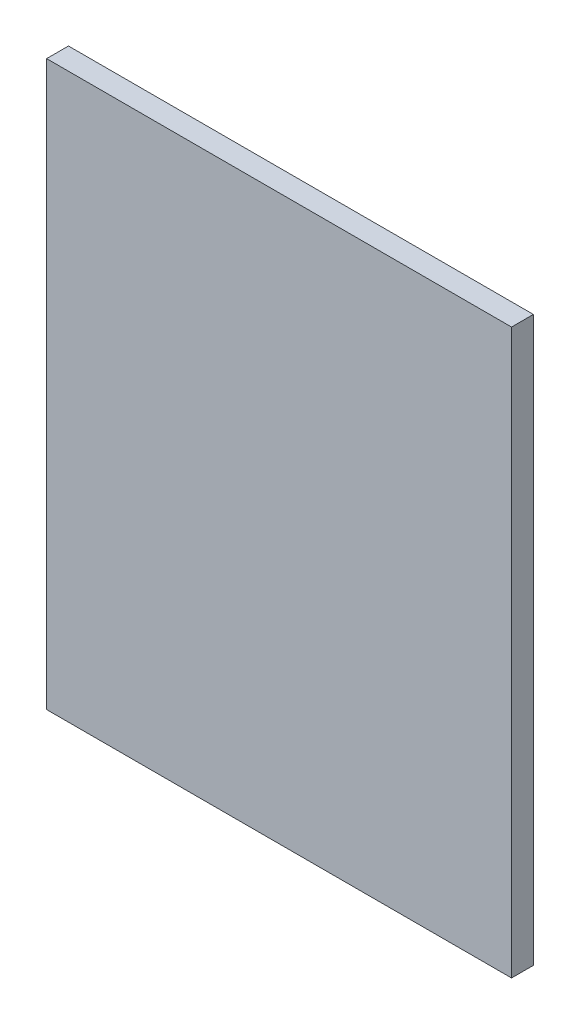
ISO-10303-21;
HEADER;
FILE_DESCRIPTION(('STEP AP214'),'2;1');
FILE_NAME('part.step','',(''),(''),'','','');
FILE_SCHEMA(('AUTOMOTIVE_DESIGN { 1 0 10303 214 1 1 1 1 }'));
ENDSEC;
DATA;
#1=APPLICATION_CONTEXT('core data for automotive mechanical design processes');
#2=APPLICATION_PROTOCOL_DEFINITION('international standard','automotive_design',2000,#1);
#3=PRODUCT_CONTEXT('',#1,'mechanical');
#4=PRODUCT('Part','Part','',(#3));
#5=PRODUCT_RELATED_PRODUCT_CATEGORY('part','',(#4));
#6=PRODUCT_DEFINITION_FORMATION('','',#4);
#7=PRODUCT_DEFINITION_CONTEXT('part definition',#1,'design');
#8=PRODUCT_DEFINITION('design','',#6,#7);
#9=PRODUCT_DEFINITION_SHAPE('','',#8);
#10=(LENGTH_UNIT() NAMED_UNIT(*) SI_UNIT(.MILLI.,.METRE.));
#11=(NAMED_UNIT(*) PLANE_ANGLE_UNIT() SI_UNIT($,.RADIAN.));
#12=(NAMED_UNIT(*) SI_UNIT($,.STERADIAN.) SOLID_ANGLE_UNIT());
#13=UNCERTAINTY_MEASURE_WITH_UNIT(LENGTH_MEASURE(1.E-05),#10,'distance_accuracy_value','');
#14=(GEOMETRIC_REPRESENTATION_CONTEXT(3) GLOBAL_UNCERTAINTY_ASSIGNED_CONTEXT((#13)) GLOBAL_UNIT_ASSIGNED_CONTEXT((#10,
#11,#12)) REPRESENTATION_CONTEXT('',''));
#15=CARTESIAN_POINT('',(0.,0.,0.));
#16=DIRECTION('',(0.,0.,1.));
#17=DIRECTION('',(1.,0.,0.));
#18=AXIS2_PLACEMENT_3D('',#15,#16,#17);
#19=CARTESIAN_POINT('',(61.5,121.5,-818.5));
#20=DIRECTION('',(-1.,0.,0.));
#21=DIRECTION('',(0.,0.,1.));
#22=AXIS2_PLACEMENT_3D('',#19,#20,#21);
#23=PLANE('',#22);
#24=DIRECTION('',(0.,-1.,0.));
#25=VECTOR('',#24,1.);
#26=CARTESIAN_POINT('',(61.5,121.5,-758.5));
#27=LINE('',#26,#25);
#28=CARTESIAN_POINT('',(61.5,1670.,-758.5));
#29=VERTEX_POINT('',#28);
#30=CARTESIAN_POINT('',(61.5,121.5,-758.5));
#31=VERTEX_POINT('',#30);
#32=EDGE_CURVE('E103',#29,#31,#27,.T.);
#33=ORIENTED_EDGE('',*,*,#32,.F.);
#34=DIRECTION('',(0.,0.,1.));
#35=VECTOR('',#34,1.);
#36=CARTESIAN_POINT('',(61.5,1670.,-818.5));
#37=LINE('',#36,#35);
#38=CARTESIAN_POINT('',(61.5,1670.,-818.5));
#39=VERTEX_POINT('',#38);
#40=EDGE_CURVE('E11',#39,#29,#37,.T.);
#41=ORIENTED_EDGE('',*,*,#40,.F.);
#42=DIRECTION('',(0.,-1.,0.));
#43=VECTOR('',#42,1.);
#44=CARTESIAN_POINT('',(61.5,121.5,-818.5));
#45=LINE('',#44,#43);
#46=CARTESIAN_POINT('',(61.5,121.5,-818.5));
#47=VERTEX_POINT('',#46);
#48=EDGE_CURVE('E97',#39,#47,#45,.T.);
#49=ORIENTED_EDGE('',*,*,#48,.T.);
#50=DIRECTION('',(0.,0.,1.));
#51=VECTOR('',#50,1.);
#52=CARTESIAN_POINT('',(61.5,121.5,-818.5));
#53=LINE('',#52,#51);
#54=EDGE_CURVE('E42',#47,#31,#53,.T.);
#55=ORIENTED_EDGE('',*,*,#54,.T.);
#56=EDGE_LOOP('',(#33,#41,#49,#55));
#57=FACE_BOUND('',#56,.T.);
#58=ADVANCED_FACE('F39',(#57),#23,.T.);
#59=CARTESIAN_POINT('',(61.5,1670.,-818.5));
#60=DIRECTION('',(0.,1.,0.));
#61=DIRECTION('',(0.,0.,1.));
#62=AXIS2_PLACEMENT_3D('',#59,#60,#61);
#63=PLANE('',#62);
#64=DIRECTION('',(-1.,0.,0.));
#65=VECTOR('',#64,1.);
#66=CARTESIAN_POINT('',(61.5,1670.,-758.5));
#67=LINE('',#66,#65);
#68=CARTESIAN_POINT('',(1338.5,1670.,-758.5));
#69=VERTEX_POINT('',#68);
#70=EDGE_CURVE('E99',#69,#29,#67,.T.);
#71=ORIENTED_EDGE('',*,*,#70,.F.);
#72=DIRECTION('',(0.,0.,1.));
#73=VECTOR('',#72,1.);
#74=CARTESIAN_POINT('',(1338.5,1670.,-818.5));
#75=LINE('',#74,#73);
#76=CARTESIAN_POINT('',(1338.5,1670.,-818.5));
#77=VERTEX_POINT('',#76);
#78=EDGE_CURVE('E48',#77,#69,#75,.T.);
#79=ORIENTED_EDGE('',*,*,#78,.F.);
#80=DIRECTION('',(-1.,0.,0.));
#81=VECTOR('',#80,1.);
#82=CARTESIAN_POINT('',(61.5,1670.,-818.5));
#83=LINE('',#82,#81);
#84=EDGE_CURVE('E94',#77,#39,#83,.T.);
#85=ORIENTED_EDGE('',*,*,#84,.T.);
#86=ORIENTED_EDGE('',*,*,#40,.T.);
#87=EDGE_LOOP('',(#71,#79,#85,#86));
#88=FACE_BOUND('',#87,.T.);
#89=ADVANCED_FACE('F113',(#88),#63,.T.);
#90=CARTESIAN_POINT('',(1338.5,121.5,-818.5));
#91=DIRECTION('',(1.,0.,0.));
#92=DIRECTION('',(0.,0.,-1.));
#93=AXIS2_PLACEMENT_3D('',#90,#91,#92);
#94=PLANE('',#93);
#95=DIRECTION('',(0.,1.,0.));
#96=VECTOR('',#95,1.);
#97=CARTESIAN_POINT('',(1338.5,121.5,-758.5));
#98=LINE('',#97,#96);
#99=CARTESIAN_POINT('',(1338.5,121.5,-758.5));
#100=VERTEX_POINT('',#99);
#101=EDGE_CURVE('E89',#100,#69,#98,.T.);
#102=ORIENTED_EDGE('',*,*,#101,.F.);
#103=DIRECTION('',(0.,0.,1.));
#104=VECTOR('',#103,1.);
#105=CARTESIAN_POINT('',(1338.5,121.5,-818.5));
#106=LINE('',#105,#104);
#107=CARTESIAN_POINT('',(1338.5,121.5,-818.5));
#108=VERTEX_POINT('',#107);
#109=EDGE_CURVE('E84',#108,#100,#106,.T.);
#110=ORIENTED_EDGE('',*,*,#109,.F.);
#111=DIRECTION('',(0.,1.,0.));
#112=VECTOR('',#111,1.);
#113=CARTESIAN_POINT('',(1338.5,121.5,-818.5));
#114=LINE('',#113,#112);
#115=EDGE_CURVE('E87',#108,#77,#114,.T.);
#116=ORIENTED_EDGE('',*,*,#115,.T.);
#117=ORIENTED_EDGE('',*,*,#78,.T.);
#118=EDGE_LOOP('',(#102,#110,#116,#117));
#119=FACE_BOUND('',#118,.T.);
#120=ADVANCED_FACE('F86',(#119),#94,.T.);
#121=CARTESIAN_POINT('',(61.5,121.5,-818.5));
#122=DIRECTION('',(0.,-1.,0.));
#123=DIRECTION('',(0.,0.,-1.));
#124=AXIS2_PLACEMENT_3D('',#121,#122,#123);
#125=PLANE('',#124);
#126=DIRECTION('',(1.,0.,0.));
#127=VECTOR('',#126,1.);
#128=CARTESIAN_POINT('',(61.5,121.5,-758.5));
#129=LINE('',#128,#127);
#130=EDGE_CURVE('E106',#31,#100,#129,.T.);
#131=ORIENTED_EDGE('',*,*,#130,.F.);
#132=ORIENTED_EDGE('',*,*,#54,.F.);
#133=DIRECTION('',(1.,0.,0.));
#134=VECTOR('',#133,1.);
#135=CARTESIAN_POINT('',(61.5,121.5,-818.5));
#136=LINE('',#135,#134);
#137=EDGE_CURVE('E93',#47,#108,#136,.T.);
#138=ORIENTED_EDGE('',*,*,#137,.T.);
#139=ORIENTED_EDGE('',*,*,#109,.T.);
#140=EDGE_LOOP('',(#131,#132,#138,#139));
#141=FACE_BOUND('',#140,.T.);
#142=ADVANCED_FACE('F96',(#141),#125,.T.);
#143=CARTESIAN_POINT('',(0.,0.,-818.5));
#144=DIRECTION('',(0.,0.,-1.));
#145=DIRECTION('',(-1.,0.,0.));
#146=AXIS2_PLACEMENT_3D('',#143,#144,#145);
#147=PLANE('',#146);
#148=ORIENTED_EDGE('',*,*,#48,.F.);
#149=ORIENTED_EDGE('',*,*,#84,.F.);
#150=ORIENTED_EDGE('',*,*,#115,.F.);
#151=ORIENTED_EDGE('',*,*,#137,.F.);
#152=EDGE_LOOP('',(#148,#149,#150,#151));
#153=FACE_BOUND('',#152,.T.);
#154=ADVANCED_FACE('F92',(#153),#147,.T.);
#155=CARTESIAN_POINT('',(0.,0.,-758.5));
#156=DIRECTION('',(0.,0.,-1.));
#157=DIRECTION('',(-1.,0.,0.));
#158=AXIS2_PLACEMENT_3D('',#155,#156,#157);
#159=PLANE('',#158);
#160=ORIENTED_EDGE('',*,*,#32,.T.);
#161=ORIENTED_EDGE('',*,*,#130,.T.);
#162=ORIENTED_EDGE('',*,*,#101,.T.);
#163=ORIENTED_EDGE('',*,*,#70,.T.);
#164=EDGE_LOOP('',(#160,#161,#162,#163));
#165=FACE_BOUND('',#164,.T.);
#166=ADVANCED_FACE('F112',(#165),#159,.F.);
#167=CLOSED_SHELL('',(#58,#89,#120,#142,#154,#166));
#168=MANIFOLD_SOLID_BREP('B2',#167);
#169=ADVANCED_BREP_SHAPE_REPRESENTATION('',(#18,#168),#14);
#170=SHAPE_DEFINITION_REPRESENTATION(#9,#169);
ENDSEC;
END-ISO-10303-21;
